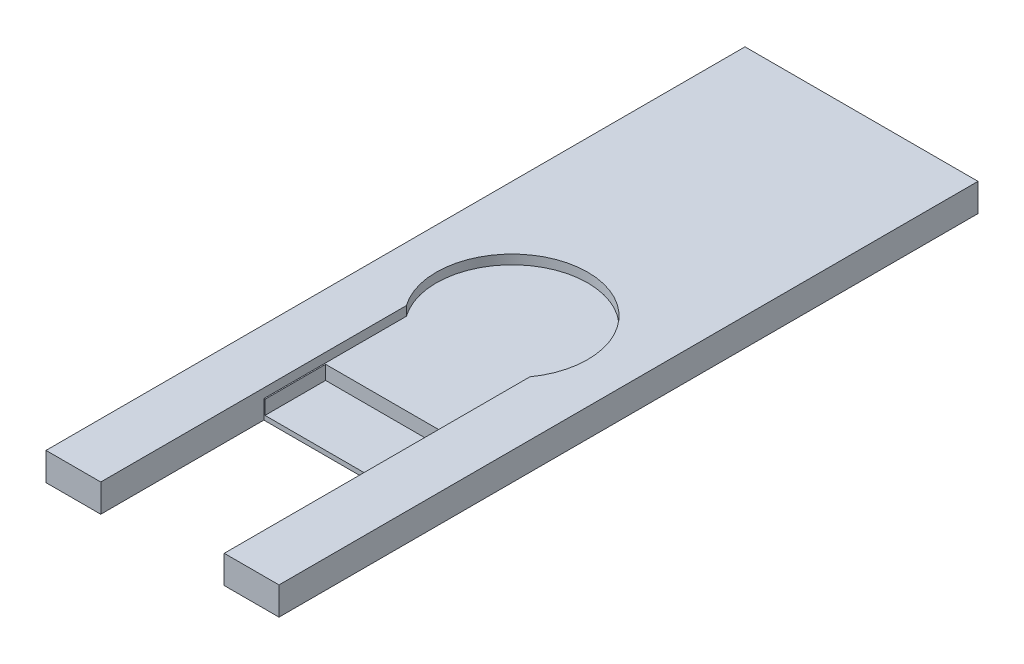
ISO-10303-21;
HEADER;
FILE_DESCRIPTION(('STEP AP214'),'2;1');
FILE_NAME('part.step','',(''),(''),'','','');
FILE_SCHEMA(('AUTOMOTIVE_DESIGN { 1 0 10303 214 1 1 1 1 }'));
ENDSEC;
DATA;
#1=APPLICATION_CONTEXT('core data for automotive mechanical design processes');
#2=APPLICATION_PROTOCOL_DEFINITION('international standard','automotive_design',2000,#1);
#3=PRODUCT_CONTEXT('',#1,'mechanical');
#4=PRODUCT('Part','Part','',(#3));
#5=PRODUCT_RELATED_PRODUCT_CATEGORY('part','',(#4));
#6=PRODUCT_DEFINITION_FORMATION('','',#4);
#7=PRODUCT_DEFINITION_CONTEXT('part definition',#1,'design');
#8=PRODUCT_DEFINITION('design','',#6,#7);
#9=PRODUCT_DEFINITION_SHAPE('','',#8);
#10=(LENGTH_UNIT() NAMED_UNIT(*) SI_UNIT(.MILLI.,.METRE.));
#11=(NAMED_UNIT(*) PLANE_ANGLE_UNIT() SI_UNIT($,.RADIAN.));
#12=(NAMED_UNIT(*) SI_UNIT($,.STERADIAN.) SOLID_ANGLE_UNIT());
#13=UNCERTAINTY_MEASURE_WITH_UNIT(LENGTH_MEASURE(1.E-05),#10,'distance_accuracy_value','');
#14=(GEOMETRIC_REPRESENTATION_CONTEXT(3) GLOBAL_UNCERTAINTY_ASSIGNED_CONTEXT((#13)) GLOBAL_UNIT_ASSIGNED_CONTEXT((#10,
#11,#12)) REPRESENTATION_CONTEXT('',''));
#15=CARTESIAN_POINT('',(0.,0.,0.));
#16=DIRECTION('',(0.,0.,1.));
#17=DIRECTION('',(1.,0.,0.));
#18=AXIS2_PLACEMENT_3D('',#15,#16,#17);
#19=CARTESIAN_POINT('',(-5.08735195444298,1.524,28.5140513925074));
#20=DIRECTION('',(0.,0.,-1.));
#21=DIRECTION('',(-1.,0.,0.));
#22=AXIS2_PLACEMENT_3D('',#19,#20,#21);
#23=PLANE('',#22);
#24=DIRECTION('',(1.,0.,0.));
#25=VECTOR('',#24,1.);
#26=CARTESIAN_POINT('',(-5.08735195444298,0.,28.5140513925074));
#27=LINE('',#26,#25);
#28=CARTESIAN_POINT('',(-5.08735195444298,0.,28.5140513925074));
#29=VERTEX_POINT('',#28);
#30=CARTESIAN_POINT('',(-2.10285195375351,0.,28.5140513925074));
#31=VERTEX_POINT('',#30);
#32=EDGE_CURVE('E373',#29,#31,#27,.T.);
#33=ORIENTED_EDGE('',*,*,#32,.T.);
#34=DIRECTION('',(0.,1.,0.));
#35=VECTOR('',#34,1.);
#36=CARTESIAN_POINT('',(-2.10285195375351,1.016,28.5140513925074));
#37=LINE('',#36,#35);
#38=CARTESIAN_POINT('',(-2.10285195375351,1.524,28.5140513925074));
#39=VERTEX_POINT('',#38);
#40=EDGE_CURVE('E259',#31,#39,#37,.T.);
#41=ORIENTED_EDGE('',*,*,#40,.T.);
#42=DIRECTION('',(1.,0.,0.));
#43=VECTOR('',#42,1.);
#44=CARTESIAN_POINT('',(-5.08735195444298,1.524,28.5140513925074));
#45=LINE('',#44,#43);
#46=CARTESIAN_POINT('',(-5.08735195444298,1.524,28.5140513925074));
#47=VERTEX_POINT('',#46);
#48=EDGE_CURVE('E358',#47,#39,#45,.T.);
#49=ORIENTED_EDGE('',*,*,#48,.F.);
#50=DIRECTION('',(0.,-1.,0.));
#51=VECTOR('',#50,1.);
#52=CARTESIAN_POINT('',(-5.08735195444298,1.524,28.5140513925074));
#53=LINE('',#52,#51);
#54=EDGE_CURVE('E11',#47,#29,#53,.T.);
#55=ORIENTED_EDGE('',*,*,#54,.T.);
#56=EDGE_LOOP('',(#33,#41,#49,#55));
#57=FACE_BOUND('',#56,.T.);
#58=ADVANCED_FACE('F42',(#57),#23,.F.);
#59=DIRECTION('',(0.,1.,0.));
#60=VECTOR('',#59,1.);
#61=CARTESIAN_POINT('',(4.62814804624649,1.016,28.5140513925074));
#62=LINE('',#61,#60);
#63=CARTESIAN_POINT('',(4.62814804624649,0.,28.5140513925074));
#64=VERTEX_POINT('',#63);
#65=CARTESIAN_POINT('',(4.62814804624649,1.524,28.5140513925074));
#66=VERTEX_POINT('',#65);
#67=EDGE_CURVE('E256',#64,#66,#62,.T.);
#68=ORIENTED_EDGE('',*,*,#67,.F.);
#69=CARTESIAN_POINT('',(7.61264804555702,0.,28.5140513925074));
#70=VERTEX_POINT('',#69);
#71=EDGE_CURVE('E372',#64,#70,#27,.T.);
#72=ORIENTED_EDGE('',*,*,#71,.T.);
#73=DIRECTION('',(0.,-1.,0.));
#74=VECTOR('',#73,1.);
#75=CARTESIAN_POINT('',(7.61264804555702,1.524,28.5140513925074));
#76=LINE('',#75,#74);
#77=CARTESIAN_POINT('',(7.61264804555702,1.524,28.5140513925074));
#78=VERTEX_POINT('',#77);
#79=EDGE_CURVE('E51',#78,#70,#76,.T.);
#80=ORIENTED_EDGE('',*,*,#79,.F.);
#81=EDGE_CURVE('E356',#66,#78,#45,.T.);
#82=ORIENTED_EDGE('',*,*,#81,.F.);
#83=EDGE_LOOP('',(#68,#72,#80,#82));
#84=FACE_BOUND('',#83,.T.);
#85=ADVANCED_FACE('F417',(#84),#23,.F.);
#86=CARTESIAN_POINT('',(0.,1.524,0.));
#87=DIRECTION('',(0.,1.,0.));
#88=DIRECTION('',(0.,0.,1.));
#89=AXIS2_PLACEMENT_3D('',#86,#87,#88);
#90=PLANE('',#89);
#91=CARTESIAN_POINT('',(1.26264804555376,1.524,9.46405139250738));
#92=DIRECTION('',(0.,1.,0.));
#93=DIRECTION('',(0.,0.,1.));
#94=AXIS2_PLACEMENT_3D('',#91,#92,#93);
#95=CIRCLE('',#94,4.12750000000079);
#96=CARTESIAN_POINT('',(4.62814804624649,1.524,11.8535421332451));
#97=VERTEX_POINT('',#96);
#98=CARTESIAN_POINT('',(-2.10285195375351,1.524,11.8535421332451));
#99=VERTEX_POINT('',#98);
#100=EDGE_CURVE('E66',#97,#99,#95,.T.);
#101=ORIENTED_EDGE('',*,*,#100,.F.);
#102=DIRECTION('',(0.,0.,1.));
#103=VECTOR('',#102,1.);
#104=CARTESIAN_POINT('',(4.62814804624649,1.524,0.));
#105=LINE('',#104,#103);
#106=EDGE_CURVE('E236',#97,#66,#105,.T.);
#107=ORIENTED_EDGE('',*,*,#106,.T.);
#108=ORIENTED_EDGE('',*,*,#81,.T.);
#109=DIRECTION('',(0.,0.,-1.));
#110=VECTOR('',#109,1.);
#111=CARTESIAN_POINT('',(7.61264804555702,1.524,-9.58594860749262));
#112=LINE('',#111,#110);
#113=CARTESIAN_POINT('',(7.61264804555702,1.524,-9.58594860749262));
#114=VERTEX_POINT('',#113);
#115=EDGE_CURVE('E362',#78,#114,#112,.T.);
#116=ORIENTED_EDGE('',*,*,#115,.T.);
#117=DIRECTION('',(-1.,0.,0.));
#118=VECTOR('',#117,1.);
#119=CARTESIAN_POINT('',(-5.08735195444298,1.524,-9.58594860749262));
#120=LINE('',#119,#118);
#121=CARTESIAN_POINT('',(-5.08735195444298,1.524,-9.58594860749262));
#122=VERTEX_POINT('',#121);
#123=EDGE_CURVE('E365',#114,#122,#120,.T.);
#124=ORIENTED_EDGE('',*,*,#123,.T.);
#125=DIRECTION('',(0.,0.,1.));
#126=VECTOR('',#125,1.);
#127=CARTESIAN_POINT('',(-5.08735195444298,1.524,-9.58594860749262));
#128=LINE('',#127,#126);
#129=EDGE_CURVE('E352',#122,#47,#128,.T.);
#130=ORIENTED_EDGE('',*,*,#129,.T.);
#131=ORIENTED_EDGE('',*,*,#48,.T.);
#132=DIRECTION('',(0.,0.,1.));
#133=VECTOR('',#132,1.);
#134=CARTESIAN_POINT('',(-2.10285195375351,1.524,0.));
#135=LINE('',#134,#133);
#136=EDGE_CURVE('E246',#99,#39,#135,.T.);
#137=ORIENTED_EDGE('',*,*,#136,.F.);
#138=EDGE_LOOP('',(#101,#107,#108,#116,#124,#130,#131,#137));
#139=FACE_BOUND('',#138,.T.);
#140=ADVANCED_FACE('F412',(#139),#90,.T.);
#141=CARTESIAN_POINT('',(0.,0.,0.));
#142=DIRECTION('',(0.,1.,0.));
#143=DIRECTION('',(0.,0.,1.));
#144=AXIS2_PLACEMENT_3D('',#141,#142,#143);
#145=PLANE('',#144);
#146=DIRECTION('',(-1.,0.,0.));
#147=VECTOR('',#146,1.);
#148=CARTESIAN_POINT('',(0.,0.,19.6240513925074));
#149=LINE('',#148,#147);
#150=CARTESIAN_POINT('',(4.62814804624649,0.,19.6240513925074));
#151=VERTEX_POINT('',#150);
#152=CARTESIAN_POINT('',(-2.10285195375351,0.,19.6240513925074));
#153=VERTEX_POINT('',#152);
#154=EDGE_CURVE('E210',#151,#153,#149,.T.);
#155=ORIENTED_EDGE('',*,*,#154,.T.);
#156=DIRECTION('',(0.,0.,1.));
#157=VECTOR('',#156,1.);
#158=CARTESIAN_POINT('',(-2.10285195375351,0.,0.));
#159=LINE('',#158,#157);
#160=EDGE_CURVE('E227',#153,#31,#159,.T.);
#161=ORIENTED_EDGE('',*,*,#160,.T.);
#162=ORIENTED_EDGE('',*,*,#32,.F.);
#163=DIRECTION('',(0.,0.,1.));
#164=VECTOR('',#163,1.);
#165=CARTESIAN_POINT('',(-5.08735195444298,0.,-9.58594860749262));
#166=LINE('',#165,#164);
#167=CARTESIAN_POINT('',(-5.08735195444298,0.,-9.58594860749262));
#168=VERTEX_POINT('',#167);
#169=EDGE_CURVE('E351',#168,#29,#166,.T.);
#170=ORIENTED_EDGE('',*,*,#169,.F.);
#171=DIRECTION('',(-1.,0.,0.));
#172=VECTOR('',#171,1.);
#173=CARTESIAN_POINT('',(-5.08735195444298,0.,-9.58594860749262));
#174=LINE('',#173,#172);
#175=CARTESIAN_POINT('',(7.61264804555702,0.,-9.58594860749262));
#176=VERTEX_POINT('',#175);
#177=EDGE_CURVE('E357',#176,#168,#174,.T.);
#178=ORIENTED_EDGE('',*,*,#177,.F.);
#179=DIRECTION('',(0.,0.,-1.));
#180=VECTOR('',#179,1.);
#181=CARTESIAN_POINT('',(7.61264804555702,0.,-9.58594860749262));
#182=LINE('',#181,#180);
#183=EDGE_CURVE('E377',#70,#176,#182,.T.);
#184=ORIENTED_EDGE('',*,*,#183,.F.);
#185=ORIENTED_EDGE('',*,*,#71,.F.);
#186=DIRECTION('',(0.,0.,-1.));
#187=VECTOR('',#186,1.);
#188=CARTESIAN_POINT('',(4.62814804624649,0.,0.));
#189=LINE('',#188,#187);
#190=EDGE_CURVE('E218',#64,#151,#189,.T.);
#191=ORIENTED_EDGE('',*,*,#190,.T.);
#192=EDGE_LOOP('',(#155,#161,#162,#170,#178,#184,#185,#191));
#193=FACE_BOUND('',#192,.T.);
#194=DIRECTION('',(0.,0.,-1.));
#195=VECTOR('',#194,1.);
#196=CARTESIAN_POINT('',(-2.0393519537259,0.,16.9570513924994));
#197=LINE('',#196,#195);
#198=CARTESIAN_POINT('',(-2.0393519537259,0.,16.9570513924994));
#199=VERTEX_POINT('',#198);
#200=CARTESIAN_POINT('',(-2.03935195372589,0.,-6.91894860750063));
#201=VERTEX_POINT('',#200);
#202=EDGE_CURVE('E306',#199,#201,#197,.T.);
#203=ORIENTED_EDGE('',*,*,#202,.F.);
#204=DIRECTION('',(-1.,0.,0.));
#205=VECTOR('',#204,1.);
#206=CARTESIAN_POINT('',(-2.0393519537259,0.,16.9570513924994));
#207=LINE('',#206,#205);
#208=CARTESIAN_POINT('',(4.56464804627411,0.,16.9570513924994));
#209=VERTEX_POINT('',#208);
#210=EDGE_CURVE('E312',#209,#199,#207,.T.);
#211=ORIENTED_EDGE('',*,*,#210,.F.);
#212=DIRECTION('',(0.,0.,1.));
#213=VECTOR('',#212,1.);
#214=CARTESIAN_POINT('',(4.56464804627411,0.,16.9570513924994));
#215=LINE('',#214,#213);
#216=CARTESIAN_POINT('',(4.56464804627411,0.,-6.91894860750063));
#217=VERTEX_POINT('',#216);
#218=EDGE_CURVE('E329',#217,#209,#215,.T.);
#219=ORIENTED_EDGE('',*,*,#218,.F.);
#220=DIRECTION('',(1.,0.,0.));
#221=VECTOR('',#220,1.);
#222=CARTESIAN_POINT('',(-2.03935195372589,0.,-6.91894860750063));
#223=LINE('',#222,#221);
#224=EDGE_CURVE('E325',#201,#217,#223,.T.);
#225=ORIENTED_EDGE('',*,*,#224,.F.);
#226=EDGE_LOOP('',(#203,#211,#219,#225));
#227=FACE_BOUND('',#226,.T.);
#228=ADVANCED_FACE('F401',(#193,#227),#145,.F.);
#229=CARTESIAN_POINT('',(-5.08735195444298,1.524,-9.58594860749262));
#230=DIRECTION('',(1.,0.,0.));
#231=DIRECTION('',(0.,0.,-1.));
#232=AXIS2_PLACEMENT_3D('',#229,#230,#231);
#233=PLANE('',#232);
#234=ORIENTED_EDGE('',*,*,#169,.T.);
#235=ORIENTED_EDGE('',*,*,#54,.F.);
#236=ORIENTED_EDGE('',*,*,#129,.F.);
#237=DIRECTION('',(0.,-1.,0.));
#238=VECTOR('',#237,1.);
#239=CARTESIAN_POINT('',(-5.08735195444298,1.524,-9.58594860749262));
#240=LINE('',#239,#238);
#241=EDGE_CURVE('E368',#122,#168,#240,.T.);
#242=ORIENTED_EDGE('',*,*,#241,.T.);
#243=EDGE_LOOP('',(#234,#235,#236,#242));
#244=FACE_BOUND('',#243,.T.);
#245=ADVANCED_FACE('F44',(#244),#233,.F.);
#246=CARTESIAN_POINT('',(7.61264804555702,1.524,-9.58594860749262));
#247=DIRECTION('',(-1.,0.,0.));
#248=DIRECTION('',(0.,0.,1.));
#249=AXIS2_PLACEMENT_3D('',#246,#247,#248);
#250=PLANE('',#249);
#251=ORIENTED_EDGE('',*,*,#183,.T.);
#252=DIRECTION('',(0.,-1.,0.));
#253=VECTOR('',#252,1.);
#254=CARTESIAN_POINT('',(7.61264804555702,1.524,-9.58594860749262));
#255=LINE('',#254,#253);
#256=EDGE_CURVE('E385',#114,#176,#255,.T.);
#257=ORIENTED_EDGE('',*,*,#256,.F.);
#258=ORIENTED_EDGE('',*,*,#115,.F.);
#259=ORIENTED_EDGE('',*,*,#79,.T.);
#260=EDGE_LOOP('',(#251,#257,#258,#259));
#261=FACE_BOUND('',#260,.T.);
#262=ADVANCED_FACE('F394',(#261),#250,.F.);
#263=CARTESIAN_POINT('',(-5.08735195444298,1.524,-9.58594860749262));
#264=DIRECTION('',(0.,0.,1.));
#265=DIRECTION('',(1.,0.,0.));
#266=AXIS2_PLACEMENT_3D('',#263,#264,#265);
#267=PLANE('',#266);
#268=ORIENTED_EDGE('',*,*,#177,.T.);
#269=ORIENTED_EDGE('',*,*,#241,.F.);
#270=ORIENTED_EDGE('',*,*,#123,.F.);
#271=ORIENTED_EDGE('',*,*,#256,.T.);
#272=EDGE_LOOP('',(#268,#269,#270,#271));
#273=FACE_BOUND('',#272,.T.);
#274=ADVANCED_FACE('F406',(#273),#267,.F.);
#275=CARTESIAN_POINT('',(0.,-2.032,0.));
#276=DIRECTION('',(0.,-1.,0.));
#277=DIRECTION('',(0.,0.,-1.));
#278=AXIS2_PLACEMENT_3D('',#275,#276,#277);
#279=PLANE('',#278);
#280=DIRECTION('',(0.,0.,-1.));
#281=VECTOR('',#280,1.);
#282=CARTESIAN_POINT('',(-2.0393519537259,-2.032,16.9570513924994));
#283=LINE('',#282,#281);
#284=CARTESIAN_POINT('',(-2.0393519537259,-2.032,16.9570513924994));
#285=VERTEX_POINT('',#284);
#286=CARTESIAN_POINT('',(-2.03935195372589,-2.032,-6.91894860750063));
#287=VERTEX_POINT('',#286);
#288=EDGE_CURVE('E307',#285,#287,#283,.T.);
#289=ORIENTED_EDGE('',*,*,#288,.T.);
#290=DIRECTION('',(1.,0.,0.));
#291=VECTOR('',#290,1.);
#292=CARTESIAN_POINT('',(-2.03935195372589,-2.032,-6.91894860750063));
#293=LINE('',#292,#291);
#294=CARTESIAN_POINT('',(4.56464804627411,-2.032,-6.91894860750063));
#295=VERTEX_POINT('',#294);
#296=EDGE_CURVE('E311',#287,#295,#293,.T.);
#297=ORIENTED_EDGE('',*,*,#296,.T.);
#298=DIRECTION('',(0.,0.,1.));
#299=VECTOR('',#298,1.);
#300=CARTESIAN_POINT('',(4.56464804627411,-2.032,16.9570513924994));
#301=LINE('',#300,#299);
#302=CARTESIAN_POINT('',(4.56464804627411,-2.032,16.9570513924994));
#303=VERTEX_POINT('',#302);
#304=EDGE_CURVE('E315',#295,#303,#301,.T.);
#305=ORIENTED_EDGE('',*,*,#304,.T.);
#306=DIRECTION('',(-1.,0.,0.));
#307=VECTOR('',#306,1.);
#308=CARTESIAN_POINT('',(-2.0393519537259,-2.032,16.9570513924994));
#309=LINE('',#308,#307);
#310=EDGE_CURVE('E318',#303,#285,#309,.T.);
#311=ORIENTED_EDGE('',*,*,#310,.T.);
#312=EDGE_LOOP('',(#289,#297,#305,#311));
#313=FACE_BOUND('',#312,.T.);
#314=DIRECTION('',(1.,0.,0.));
#315=VECTOR('',#314,1.);
#316=CARTESIAN_POINT('',(-1.40435195372589,-2.032,-6.15694860750063));
#317=LINE('',#316,#315);
#318=CARTESIAN_POINT('',(-1.40435195372589,-2.032,-6.15694860750063));
#319=VERTEX_POINT('',#318);
#320=CARTESIAN_POINT('',(3.92964804627411,-2.032,-6.15694860750063));
#321=VERTEX_POINT('',#320);
#322=EDGE_CURVE('E268',#319,#321,#317,.T.);
#323=ORIENTED_EDGE('',*,*,#322,.F.);
#324=DIRECTION('',(0.,0.,-1.));
#325=VECTOR('',#324,1.);
#326=CARTESIAN_POINT('',(-1.4043519537259,-2.032,16.3220513925114));
#327=LINE('',#326,#325);
#328=CARTESIAN_POINT('',(-1.4043519537259,-2.032,16.3220513925114));
#329=VERTEX_POINT('',#328);
#330=EDGE_CURVE('E265',#329,#319,#327,.T.);
#331=ORIENTED_EDGE('',*,*,#330,.F.);
#332=DIRECTION('',(-1.,0.,0.));
#333=VECTOR('',#332,1.);
#334=CARTESIAN_POINT('',(-1.4043519537259,-2.032,16.3220513925114));
#335=LINE('',#334,#333);
#336=CARTESIAN_POINT('',(3.92964804627411,-2.032,16.3220513925114));
#337=VERTEX_POINT('',#336);
#338=EDGE_CURVE('E276',#337,#329,#335,.T.);
#339=ORIENTED_EDGE('',*,*,#338,.F.);
#340=DIRECTION('',(0.,0.,1.));
#341=VECTOR('',#340,1.);
#342=CARTESIAN_POINT('',(3.92964804627411,-2.032,16.3220513925114));
#343=LINE('',#342,#341);
#344=EDGE_CURVE('E272',#321,#337,#343,.T.);
#345=ORIENTED_EDGE('',*,*,#344,.F.);
#346=EDGE_LOOP('',(#323,#331,#339,#345));
#347=FACE_BOUND('',#346,.T.);
#348=ADVANCED_FACE('F469',(#313,#347),#279,.T.);
#349=CARTESIAN_POINT('',(-2.0393519537259,-2.032,16.9570513924994));
#350=DIRECTION('',(1.,0.,0.));
#351=DIRECTION('',(0.,0.,-1.));
#352=AXIS2_PLACEMENT_3D('',#349,#350,#351);
#353=PLANE('',#352);
#354=ORIENTED_EDGE('',*,*,#202,.T.);
#355=DIRECTION('',(0.,1.,0.));
#356=VECTOR('',#355,1.);
#357=CARTESIAN_POINT('',(-2.03935195372589,-2.032,-6.91894860750063));
#358=LINE('',#357,#356);
#359=EDGE_CURVE('E347',#287,#201,#358,.T.);
#360=ORIENTED_EDGE('',*,*,#359,.F.);
#361=ORIENTED_EDGE('',*,*,#288,.F.);
#362=DIRECTION('',(0.,1.,0.));
#363=VECTOR('',#362,1.);
#364=CARTESIAN_POINT('',(-2.0393519537259,-2.032,16.9570513924994));
#365=LINE('',#364,#363);
#366=EDGE_CURVE('E321',#285,#199,#365,.T.);
#367=ORIENTED_EDGE('',*,*,#366,.T.);
#368=EDGE_LOOP('',(#354,#360,#361,#367));
#369=FACE_BOUND('',#368,.T.);
#370=ADVANCED_FACE('F477',(#369),#353,.F.);
#371=CARTESIAN_POINT('',(-2.03935195372589,-2.032,-6.91894860750063));
#372=DIRECTION('',(0.,0.,1.));
#373=DIRECTION('',(1.,0.,0.));
#374=AXIS2_PLACEMENT_3D('',#371,#372,#373);
#375=PLANE('',#374);
#376=ORIENTED_EDGE('',*,*,#224,.T.);
#377=DIRECTION('',(0.,1.,0.));
#378=VECTOR('',#377,1.);
#379=CARTESIAN_POINT('',(4.56464804627411,-2.032,-6.91894860750063));
#380=LINE('',#379,#378);
#381=EDGE_CURVE('E343',#295,#217,#380,.T.);
#382=ORIENTED_EDGE('',*,*,#381,.F.);
#383=ORIENTED_EDGE('',*,*,#296,.F.);
#384=ORIENTED_EDGE('',*,*,#359,.T.);
#385=EDGE_LOOP('',(#376,#382,#383,#384));
#386=FACE_BOUND('',#385,.T.);
#387=ADVANCED_FACE('F480',(#386),#375,.F.);
#388=CARTESIAN_POINT('',(4.56464804627411,-2.032,16.9570513924994));
#389=DIRECTION('',(-1.,0.,0.));
#390=DIRECTION('',(0.,0.,1.));
#391=AXIS2_PLACEMENT_3D('',#388,#389,#390);
#392=PLANE('',#391);
#393=ORIENTED_EDGE('',*,*,#218,.T.);
#394=DIRECTION('',(0.,1.,0.));
#395=VECTOR('',#394,1.);
#396=CARTESIAN_POINT('',(4.56464804627411,-2.032,16.9570513924994));
#397=LINE('',#396,#395);
#398=EDGE_CURVE('E339',#303,#209,#397,.T.);
#399=ORIENTED_EDGE('',*,*,#398,.F.);
#400=ORIENTED_EDGE('',*,*,#304,.F.);
#401=ORIENTED_EDGE('',*,*,#381,.T.);
#402=EDGE_LOOP('',(#393,#399,#400,#401));
#403=FACE_BOUND('',#402,.T.);
#404=ADVANCED_FACE('F484',(#403),#392,.F.);
#405=CARTESIAN_POINT('',(-2.0393519537259,-2.032,16.9570513924994));
#406=DIRECTION('',(0.,0.,-1.));
#407=DIRECTION('',(-1.,0.,0.));
#408=AXIS2_PLACEMENT_3D('',#405,#406,#407);
#409=PLANE('',#408);
#410=ORIENTED_EDGE('',*,*,#210,.T.);
#411=ORIENTED_EDGE('',*,*,#366,.F.);
#412=ORIENTED_EDGE('',*,*,#310,.F.);
#413=ORIENTED_EDGE('',*,*,#398,.T.);
#414=EDGE_LOOP('',(#410,#411,#412,#413));
#415=FACE_BOUND('',#414,.T.);
#416=ADVANCED_FACE('F488',(#415),#409,.F.);
#417=CARTESIAN_POINT('',(-1.4043519537259,-2.032,16.3220513925114));
#418=DIRECTION('',(1.,0.,0.));
#419=DIRECTION('',(0.,0.,-1.));
#420=AXIS2_PLACEMENT_3D('',#417,#418,#419);
#421=PLANE('',#420);
#422=DIRECTION('',(0.,0.,-1.));
#423=VECTOR('',#422,1.);
#424=CARTESIAN_POINT('',(-1.4043519537259,0.,16.3220513925114));
#425=LINE('',#424,#423);
#426=CARTESIAN_POINT('',(-1.4043519537259,0.,16.3220513925114));
#427=VERTEX_POINT('',#426);
#428=CARTESIAN_POINT('',(-1.40435195372589,0.,-6.15694860750063));
#429=VERTEX_POINT('',#428);
#430=EDGE_CURVE('E255',#427,#429,#425,.T.);
#431=ORIENTED_EDGE('',*,*,#430,.F.);
#432=DIRECTION('',(0.,1.,0.));
#433=VECTOR('',#432,1.);
#434=CARTESIAN_POINT('',(-1.4043519537259,-2.032,16.3220513925114));
#435=LINE('',#434,#433);
#436=EDGE_CURVE('E279',#329,#427,#435,.T.);
#437=ORIENTED_EDGE('',*,*,#436,.F.);
#438=ORIENTED_EDGE('',*,*,#330,.T.);
#439=DIRECTION('',(0.,1.,0.));
#440=VECTOR('',#439,1.);
#441=CARTESIAN_POINT('',(-1.40435195372589,-2.032,-6.15694860750063));
#442=LINE('',#441,#440);
#443=EDGE_CURVE('E302',#319,#429,#442,.T.);
#444=ORIENTED_EDGE('',*,*,#443,.T.);
#445=EDGE_LOOP('',(#431,#437,#438,#444));
#446=FACE_BOUND('',#445,.T.);
#447=ADVANCED_FACE('F492',(#446),#421,.T.);
#448=CARTESIAN_POINT('',(-1.40435195372589,-2.032,-6.15694860750063));
#449=DIRECTION('',(0.,0.,1.));
#450=DIRECTION('',(1.,0.,0.));
#451=AXIS2_PLACEMENT_3D('',#448,#449,#450);
#452=PLANE('',#451);
#453=DIRECTION('',(1.,0.,0.));
#454=VECTOR('',#453,1.);
#455=CARTESIAN_POINT('',(-1.40435195372589,0.,-6.15694860750063));
#456=LINE('',#455,#454);
#457=CARTESIAN_POINT('',(3.92964804627411,0.,-6.15694860750063));
#458=VERTEX_POINT('',#457);
#459=EDGE_CURVE('E283',#429,#458,#456,.T.);
#460=ORIENTED_EDGE('',*,*,#459,.F.);
#461=ORIENTED_EDGE('',*,*,#443,.F.);
#462=ORIENTED_EDGE('',*,*,#322,.T.);
#463=DIRECTION('',(0.,1.,0.));
#464=VECTOR('',#463,1.);
#465=CARTESIAN_POINT('',(3.92964804627411,-2.032,-6.15694860750063));
#466=LINE('',#465,#464);
#467=EDGE_CURVE('E299',#321,#458,#466,.T.);
#468=ORIENTED_EDGE('',*,*,#467,.T.);
#469=EDGE_LOOP('',(#460,#461,#462,#468));
#470=FACE_BOUND('',#469,.T.);
#471=ADVANCED_FACE('F499',(#470),#452,.T.);
#472=CARTESIAN_POINT('',(3.92964804627411,-2.032,16.3220513925114));
#473=DIRECTION('',(-1.,0.,0.));
#474=DIRECTION('',(0.,0.,1.));
#475=AXIS2_PLACEMENT_3D('',#472,#473,#474);
#476=PLANE('',#475);
#477=DIRECTION('',(0.,0.,1.));
#478=VECTOR('',#477,1.);
#479=CARTESIAN_POINT('',(3.92964804627411,0.,16.3220513925114));
#480=LINE('',#479,#478);
#481=CARTESIAN_POINT('',(3.92964804627411,0.,16.3220513925114));
#482=VERTEX_POINT('',#481);
#483=EDGE_CURVE('E287',#458,#482,#480,.T.);
#484=ORIENTED_EDGE('',*,*,#483,.F.);
#485=ORIENTED_EDGE('',*,*,#467,.F.);
#486=ORIENTED_EDGE('',*,*,#344,.T.);
#487=DIRECTION('',(0.,1.,0.));
#488=VECTOR('',#487,1.);
#489=CARTESIAN_POINT('',(3.92964804627411,-2.032,16.3220513925114));
#490=LINE('',#489,#488);
#491=EDGE_CURVE('E296',#337,#482,#490,.T.);
#492=ORIENTED_EDGE('',*,*,#491,.T.);
#493=EDGE_LOOP('',(#484,#485,#486,#492));
#494=FACE_BOUND('',#493,.T.);
#495=ADVANCED_FACE('F503',(#494),#476,.T.);
#496=CARTESIAN_POINT('',(-1.4043519537259,-2.032,16.3220513925114));
#497=DIRECTION('',(0.,0.,-1.));
#498=DIRECTION('',(-1.,0.,0.));
#499=AXIS2_PLACEMENT_3D('',#496,#497,#498);
#500=PLANE('',#499);
#501=DIRECTION('',(-1.,0.,0.));
#502=VECTOR('',#501,1.);
#503=CARTESIAN_POINT('',(-1.4043519537259,0.,16.3220513925114));
#504=LINE('',#503,#502);
#505=EDGE_CURVE('E269',#482,#427,#504,.T.);
#506=ORIENTED_EDGE('',*,*,#505,.F.);
#507=ORIENTED_EDGE('',*,*,#491,.F.);
#508=ORIENTED_EDGE('',*,*,#338,.T.);
#509=ORIENTED_EDGE('',*,*,#436,.T.);
#510=EDGE_LOOP('',(#506,#507,#508,#509));
#511=FACE_BOUND('',#510,.T.);
#512=ADVANCED_FACE('F473',(#511),#500,.T.);
#513=ORIENTED_EDGE('',*,*,#505,.T.);
#514=ORIENTED_EDGE('',*,*,#430,.T.);
#515=ORIENTED_EDGE('',*,*,#459,.T.);
#516=ORIENTED_EDGE('',*,*,#483,.T.);
#517=EDGE_LOOP('',(#513,#514,#515,#516));
#518=FACE_BOUND('',#517,.T.);
#519=ADVANCED_FACE('F470',(#518),#145,.F.);
#520=CARTESIAN_POINT('',(1.26264804555376,1.016,9.46405139250738));
#521=DIRECTION('',(0.,1.,0.));
#522=DIRECTION('',(0.,0.,1.));
#523=AXIS2_PLACEMENT_3D('',#520,#521,#522);
#524=CYLINDRICAL_SURFACE('',#523,4.12750000000079);
#525=ORIENTED_EDGE('',*,*,#100,.T.);
#526=DIRECTION('',(0.,1.,0.));
#527=VECTOR('',#526,1.);
#528=CARTESIAN_POINT('',(-2.10285195375351,1.016,11.8535421332451));
#529=LINE('',#528,#527);
#530=CARTESIAN_POINT('',(-2.10285195375351,1.016,11.8535421332451));
#531=VERTEX_POINT('',#530);
#532=EDGE_CURVE('E243',#531,#99,#529,.T.);
#533=ORIENTED_EDGE('',*,*,#532,.F.);
#534=CARTESIAN_POINT('',(1.26264804555376,1.016,9.46405139250738));
#535=DIRECTION('',(0.,1.,0.));
#536=DIRECTION('',(0.,0.,1.));
#537=AXIS2_PLACEMENT_3D('',#534,#535,#536);
#538=CIRCLE('',#537,4.12750000000079);
#539=CARTESIAN_POINT('',(4.62814804624649,1.016,11.8535421332451));
#540=VERTEX_POINT('',#539);
#541=EDGE_CURVE('E231',#540,#531,#538,.T.);
#542=ORIENTED_EDGE('',*,*,#541,.F.);
#543=DIRECTION('',(0.,1.,0.));
#544=VECTOR('',#543,1.);
#545=CARTESIAN_POINT('',(4.62814804624649,1.016,11.8535421332451));
#546=LINE('',#545,#544);
#547=EDGE_CURVE('E252',#540,#97,#546,.T.);
#548=ORIENTED_EDGE('',*,*,#547,.T.);
#549=EDGE_LOOP('',(#525,#533,#542,#548));
#550=FACE_BOUND('',#549,.T.);
#551=ADVANCED_FACE('F423',(#550),#524,.F.);
#552=CARTESIAN_POINT('',(4.62814804624649,1.016,0.));
#553=DIRECTION('',(-1.,0.,0.));
#554=DIRECTION('',(0.,0.,1.));
#555=AXIS2_PLACEMENT_3D('',#552,#553,#554);
#556=PLANE('',#555);
#557=DIRECTION('',(0.,0.,1.));
#558=VECTOR('',#557,1.);
#559=CARTESIAN_POINT('',(4.62814804624649,1.016,0.));
#560=LINE('',#559,#558);
#561=CARTESIAN_POINT('',(4.62814804624649,1.016,16.3220513925114));
#562=VERTEX_POINT('',#561);
#563=EDGE_CURVE('E240',#540,#562,#560,.T.);
#564=ORIENTED_EDGE('',*,*,#563,.T.);
#565=DIRECTION('',(0.,1.,0.));
#566=VECTOR('',#565,1.);
#567=CARTESIAN_POINT('',(4.62814804624649,0.254,16.3220513925114));
#568=LINE('',#567,#566);
#569=CARTESIAN_POINT('',(4.62814804624649,0.254,16.3220513925114));
#570=VERTEX_POINT('',#569);
#571=EDGE_CURVE('E195',#570,#562,#568,.T.);
#572=ORIENTED_EDGE('',*,*,#571,.F.);
#573=DIRECTION('',(0.,0.,-1.));
#574=VECTOR('',#573,1.);
#575=CARTESIAN_POINT('',(4.62814804624649,0.254,16.3220513925114));
#576=LINE('',#575,#574);
#577=CARTESIAN_POINT('',(4.62814804624649,0.254,19.6240513925074));
#578=VERTEX_POINT('',#577);
#579=EDGE_CURVE('E188',#578,#570,#576,.T.);
#580=ORIENTED_EDGE('',*,*,#579,.F.);
#581=DIRECTION('',(0.,1.,0.));
#582=VECTOR('',#581,1.);
#583=CARTESIAN_POINT('',(4.62814804624649,-2.032,19.6240513925074));
#584=LINE('',#583,#582);
#585=EDGE_CURVE('E193',#151,#578,#584,.T.);
#586=ORIENTED_EDGE('',*,*,#585,.F.);
#587=ORIENTED_EDGE('',*,*,#190,.F.);
#588=ORIENTED_EDGE('',*,*,#67,.T.);
#589=ORIENTED_EDGE('',*,*,#106,.F.);
#590=ORIENTED_EDGE('',*,*,#547,.F.);
#591=EDGE_LOOP('',(#564,#572,#580,#586,#587,#588,#589,#590));
#592=FACE_BOUND('',#591,.T.);
#593=ADVANCED_FACE('F190',(#592),#556,.T.);
#594=CARTESIAN_POINT('',(-2.10285195375351,1.016,0.));
#595=DIRECTION('',(-1.,0.,0.));
#596=DIRECTION('',(0.,0.,1.));
#597=AXIS2_PLACEMENT_3D('',#594,#595,#596);
#598=PLANE('',#597);
#599=ORIENTED_EDGE('',*,*,#136,.T.);
#600=ORIENTED_EDGE('',*,*,#40,.F.);
#601=ORIENTED_EDGE('',*,*,#160,.F.);
#602=DIRECTION('',(0.,1.,0.));
#603=VECTOR('',#602,1.);
#604=CARTESIAN_POINT('',(-2.10285195375351,-2.032,19.6240513925074));
#605=LINE('',#604,#603);
#606=CARTESIAN_POINT('',(-2.10285195375351,1.016,19.6240513925074));
#607=VERTEX_POINT('',#606);
#608=EDGE_CURVE('E212',#153,#607,#605,.T.);
#609=ORIENTED_EDGE('',*,*,#608,.T.);
#610=DIRECTION('',(0.,0.,1.));
#611=VECTOR('',#610,1.);
#612=CARTESIAN_POINT('',(-2.10285195375351,1.016,0.));
#613=LINE('',#612,#611);
#614=EDGE_CURVE('E235',#531,#607,#613,.T.);
#615=ORIENTED_EDGE('',*,*,#614,.F.);
#616=ORIENTED_EDGE('',*,*,#532,.T.);
#617=EDGE_LOOP('',(#599,#600,#601,#609,#615,#616));
#618=FACE_BOUND('',#617,.T.);
#619=ADVANCED_FACE('F420',(#618),#598,.F.);
#620=CARTESIAN_POINT('',(0.,1.016,0.));
#621=DIRECTION('',(0.,1.,0.));
#622=DIRECTION('',(0.,0.,1.));
#623=AXIS2_PLACEMENT_3D('',#620,#621,#622);
#624=PLANE('',#623);
#625=DIRECTION('',(0.,0.,1.));
#626=VECTOR('',#625,1.);
#627=CARTESIAN_POINT('',(-2.0393519537259,1.016,16.3220513925114));
#628=LINE('',#627,#626);
#629=CARTESIAN_POINT('',(-2.0393519537259,1.016,16.3220513925114));
#630=VERTEX_POINT('',#629);
#631=CARTESIAN_POINT('',(-2.03935195372589,1.016,19.6240513925074));
#632=VERTEX_POINT('',#631);
#633=EDGE_CURVE('E432',#630,#632,#628,.T.);
#634=ORIENTED_EDGE('',*,*,#633,.F.);
#635=DIRECTION('',(-1.,0.,0.));
#636=VECTOR('',#635,1.);
#637=CARTESIAN_POINT('',(-2.0393519537259,1.016,16.3220513925114));
#638=LINE('',#637,#636);
#639=EDGE_CURVE('E431',#562,#630,#638,.T.);
#640=ORIENTED_EDGE('',*,*,#639,.F.);
#641=ORIENTED_EDGE('',*,*,#563,.F.);
#642=ORIENTED_EDGE('',*,*,#541,.T.);
#643=ORIENTED_EDGE('',*,*,#614,.T.);
#644=DIRECTION('',(-1.,0.,0.));
#645=VECTOR('',#644,1.);
#646=CARTESIAN_POINT('',(-2.10285195375351,1.016,19.6240513925074));
#647=LINE('',#646,#645);
#648=EDGE_CURVE('E213',#632,#607,#647,.T.);
#649=ORIENTED_EDGE('',*,*,#648,.F.);
#650=EDGE_LOOP('',(#634,#640,#641,#642,#643,#649));
#651=FACE_BOUND('',#650,.T.);
#652=ADVANCED_FACE('F427',(#651),#624,.T.);
#653=CARTESIAN_POINT('',(-2.10285195375351,-2.032,19.6240513925074));
#654=DIRECTION('',(0.,0.,-1.));
#655=DIRECTION('',(-1.,0.,0.));
#656=AXIS2_PLACEMENT_3D('',#653,#654,#655);
#657=PLANE('',#656);
#658=DIRECTION('',(1.,0.,0.));
#659=VECTOR('',#658,1.);
#660=CARTESIAN_POINT('',(-2.03935195372589,0.254,19.6240513925074));
#661=LINE('',#660,#659);
#662=CARTESIAN_POINT('',(-2.0393519537259,0.254,19.6240513925074));
#663=VERTEX_POINT('',#662);
#664=EDGE_CURVE('E199',#663,#578,#661,.T.);
#665=ORIENTED_EDGE('',*,*,#664,.F.);
#666=DIRECTION('',(0.,1.,0.));
#667=VECTOR('',#666,1.);
#668=CARTESIAN_POINT('',(-2.03935195372589,0.254,19.6240513925074));
#669=LINE('',#668,#667);
#670=EDGE_CURVE('E446',#663,#632,#669,.T.);
#671=ORIENTED_EDGE('',*,*,#670,.T.);
#672=ORIENTED_EDGE('',*,*,#648,.T.);
#673=ORIENTED_EDGE('',*,*,#608,.F.);
#674=ORIENTED_EDGE('',*,*,#154,.F.);
#675=ORIENTED_EDGE('',*,*,#585,.T.);
#676=EDGE_LOOP('',(#665,#671,#672,#673,#674,#675));
#677=FACE_BOUND('',#676,.T.);
#678=ADVANCED_FACE('F207',(#677),#657,.F.);
#679=CARTESIAN_POINT('',(-2.0393519537259,0.254,16.3220513925114));
#680=DIRECTION('',(-1.,0.,0.));
#681=DIRECTION('',(0.,0.,1.));
#682=AXIS2_PLACEMENT_3D('',#679,#680,#681);
#683=PLANE('',#682);
#684=ORIENTED_EDGE('',*,*,#633,.T.);
#685=ORIENTED_EDGE('',*,*,#670,.F.);
#686=DIRECTION('',(0.,0.,1.));
#687=VECTOR('',#686,1.);
#688=CARTESIAN_POINT('',(-2.0393519537259,0.254,16.3220513925114));
#689=LINE('',#688,#687);
#690=CARTESIAN_POINT('',(-2.0393519537259,0.254,16.3220513925114));
#691=VERTEX_POINT('',#690);
#692=EDGE_CURVE('E58',#691,#663,#689,.T.);
#693=ORIENTED_EDGE('',*,*,#692,.F.);
#694=DIRECTION('',(0.,1.,0.));
#695=VECTOR('',#694,1.);
#696=CARTESIAN_POINT('',(-2.0393519537259,0.254,16.3220513925114));
#697=LINE('',#696,#695);
#698=EDGE_CURVE('E220',#691,#630,#697,.T.);
#699=ORIENTED_EDGE('',*,*,#698,.T.);
#700=EDGE_LOOP('',(#684,#685,#693,#699));
#701=FACE_BOUND('',#700,.T.);
#702=ADVANCED_FACE('F451',(#701),#683,.F.);
#703=CARTESIAN_POINT('',(-2.0393519537259,0.254,16.3220513925114));
#704=DIRECTION('',(0.,0.,-1.));
#705=DIRECTION('',(-1.,0.,0.));
#706=AXIS2_PLACEMENT_3D('',#703,#704,#705);
#707=PLANE('',#706);
#708=ORIENTED_EDGE('',*,*,#639,.T.);
#709=ORIENTED_EDGE('',*,*,#698,.F.);
#710=DIRECTION('',(-1.,0.,0.));
#711=VECTOR('',#710,1.);
#712=CARTESIAN_POINT('',(-2.0393519537259,0.254,16.3220513925114));
#713=LINE('',#712,#711);
#714=EDGE_CURVE('E198',#570,#691,#713,.T.);
#715=ORIENTED_EDGE('',*,*,#714,.F.);
#716=ORIENTED_EDGE('',*,*,#571,.T.);
#717=EDGE_LOOP('',(#708,#709,#715,#716));
#718=FACE_BOUND('',#717,.T.);
#719=ADVANCED_FACE('F449',(#718),#707,.F.);
#720=CARTESIAN_POINT('',(0.,0.254,0.));
#721=DIRECTION('',(0.,1.,0.));
#722=DIRECTION('',(0.,0.,1.));
#723=AXIS2_PLACEMENT_3D('',#720,#721,#722);
#724=PLANE('',#723);
#725=ORIENTED_EDGE('',*,*,#692,.T.);
#726=ORIENTED_EDGE('',*,*,#664,.T.);
#727=ORIENTED_EDGE('',*,*,#579,.T.);
#728=ORIENTED_EDGE('',*,*,#714,.T.);
#729=EDGE_LOOP('',(#725,#726,#727,#728));
#730=FACE_BOUND('',#729,.T.);
#731=ADVANCED_FACE('F202',(#730),#724,.T.);
#732=CLOSED_SHELL('',(#58,#85,#140,#228,#245,#262,#274,#348,#370,#387,#404,#416,#447,#471,#495,
#512,#519,#551,#593,#619,#652,#678,#702,#719,#731));
#733=MANIFOLD_SOLID_BREP('B2',#732);
#734=ADVANCED_BREP_SHAPE_REPRESENTATION('',(#18,#733),#14);
#735=SHAPE_DEFINITION_REPRESENTATION(#9,#734);
ENDSEC;
END-ISO-10303-21;
